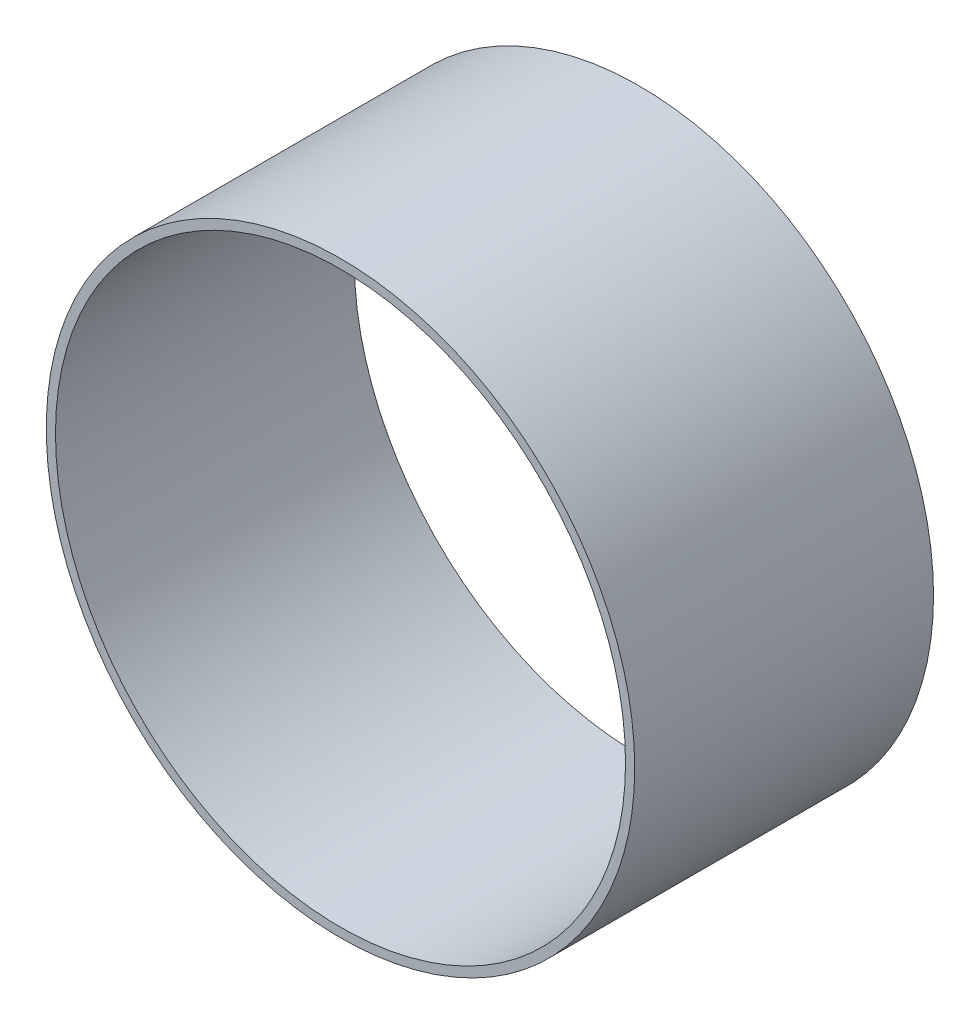
ISO-10303-21;
HEADER;
FILE_DESCRIPTION(('STEP AP214'),'2;1');
FILE_NAME('part.step','',(''),(''),'','','');
FILE_SCHEMA(('AUTOMOTIVE_DESIGN { 1 0 10303 214 1 1 1 1 }'));
ENDSEC;
DATA;
#1=APPLICATION_CONTEXT('core data for automotive mechanical design processes');
#2=APPLICATION_PROTOCOL_DEFINITION('international standard','automotive_design',2000,#1);
#3=PRODUCT_CONTEXT('',#1,'mechanical');
#4=PRODUCT('Part','Part','',(#3));
#5=PRODUCT_RELATED_PRODUCT_CATEGORY('part','',(#4));
#6=PRODUCT_DEFINITION_FORMATION('','',#4);
#7=PRODUCT_DEFINITION_CONTEXT('part definition',#1,'design');
#8=PRODUCT_DEFINITION('design','',#6,#7);
#9=PRODUCT_DEFINITION_SHAPE('','',#8);
#10=(LENGTH_UNIT() NAMED_UNIT(*) SI_UNIT(.MILLI.,.METRE.));
#11=(NAMED_UNIT(*) PLANE_ANGLE_UNIT() SI_UNIT($,.RADIAN.));
#12=(NAMED_UNIT(*) SI_UNIT($,.STERADIAN.) SOLID_ANGLE_UNIT());
#13=UNCERTAINTY_MEASURE_WITH_UNIT(LENGTH_MEASURE(1.E-05),#10,'distance_accuracy_value','');
#14=(GEOMETRIC_REPRESENTATION_CONTEXT(3) GLOBAL_UNCERTAINTY_ASSIGNED_CONTEXT((#13)) GLOBAL_UNIT_ASSIGNED_CONTEXT((#10,
#11,#12)) REPRESENTATION_CONTEXT('',''));
#15=CARTESIAN_POINT('',(0.,0.,0.));
#16=DIRECTION('',(0.,0.,1.));
#17=DIRECTION('',(1.,0.,0.));
#18=AXIS2_PLACEMENT_3D('',#15,#16,#17);
#19=CARTESIAN_POINT('',(0.,0.,33.));
#20=DIRECTION('',(0.,0.,1.));
#21=DIRECTION('',(1.,0.,0.));
#22=AXIS2_PLACEMENT_3D('',#19,#20,#21);
#23=PLANE('',#22);
#24=CARTESIAN_POINT('',(0.,0.,33.));
#25=DIRECTION('',(0.,0.,1.));
#26=DIRECTION('',(1.,0.,0.));
#27=AXIS2_PLACEMENT_3D('',#24,#25,#26);
#28=CIRCLE('',#27,64.);
#29=CARTESIAN_POINT('',(64.,0.,33.));
#30=VERTEX_POINT('',#29);
#31=EDGE_CURVE('E10',#30,#30,#28,.T.);
#32=ORIENTED_EDGE('',*,*,#31,.T.);
#33=EDGE_LOOP('',(#32));
#34=FACE_BOUND('',#33,.T.);
#35=CARTESIAN_POINT('',(0.,0.,33.));
#36=DIRECTION('',(0.,0.,1.));
#37=DIRECTION('',(1.,0.,0.));
#38=AXIS2_PLACEMENT_3D('',#35,#36,#37);
#39=CIRCLE('',#38,62.);
#40=CARTESIAN_POINT('',(62.,0.,33.));
#41=VERTEX_POINT('',#40);
#42=EDGE_CURVE('E49',#41,#41,#39,.T.);
#43=ORIENTED_EDGE('',*,*,#42,.F.);
#44=EDGE_LOOP('',(#43));
#45=FACE_BOUND('',#44,.T.);
#46=ADVANCED_FACE('F36',(#34,#45),#23,.T.);
#47=CARTESIAN_POINT('',(0.,0.,-32.));
#48=DIRECTION('',(0.,0.,1.));
#49=DIRECTION('',(1.,0.,0.));
#50=AXIS2_PLACEMENT_3D('',#47,#48,#49);
#51=PLANE('',#50);
#52=CARTESIAN_POINT('',(0.,0.,-32.));
#53=DIRECTION('',(0.,0.,1.));
#54=DIRECTION('',(1.,0.,0.));
#55=AXIS2_PLACEMENT_3D('',#52,#53,#54);
#56=CIRCLE('',#55,64.);
#57=CARTESIAN_POINT('',(64.,0.,-32.));
#58=VERTEX_POINT('',#57);
#59=EDGE_CURVE('E40',#58,#58,#56,.T.);
#60=ORIENTED_EDGE('',*,*,#59,.F.);
#61=EDGE_LOOP('',(#60));
#62=FACE_BOUND('',#61,.T.);
#63=CARTESIAN_POINT('',(0.,0.,-32.));
#64=DIRECTION('',(0.,0.,1.));
#65=DIRECTION('',(1.,0.,0.));
#66=AXIS2_PLACEMENT_3D('',#63,#64,#65);
#67=CIRCLE('',#66,62.);
#68=CARTESIAN_POINT('',(62.,0.,-32.));
#69=VERTEX_POINT('',#68);
#70=EDGE_CURVE('E51',#69,#69,#67,.T.);
#71=ORIENTED_EDGE('',*,*,#70,.T.);
#72=EDGE_LOOP('',(#71));
#73=FACE_BOUND('',#72,.T.);
#74=ADVANCED_FACE('F63',(#62,#73),#51,.F.);
#75=CARTESIAN_POINT('',(0.,0.,33.));
#76=DIRECTION('',(0.,0.,-1.));
#77=DIRECTION('',(-1.,0.,0.));
#78=AXIS2_PLACEMENT_3D('',#75,#76,#77);
#79=CYLINDRICAL_SURFACE('',#78,64.);
#80=ORIENTED_EDGE('',*,*,#31,.F.);
#81=EDGE_LOOP('',(#80));
#82=FACE_BOUND('',#81,.T.);
#83=ORIENTED_EDGE('',*,*,#59,.T.);
#84=EDGE_LOOP('',(#83));
#85=FACE_BOUND('',#84,.T.);
#86=ADVANCED_FACE('F38',(#82,#85),#79,.T.);
#87=CARTESIAN_POINT('',(0.,0.,33.));
#88=DIRECTION('',(0.,0.,-1.));
#89=DIRECTION('',(-1.,0.,0.));
#90=AXIS2_PLACEMENT_3D('',#87,#88,#89);
#91=CYLINDRICAL_SURFACE('',#90,62.);
#92=ORIENTED_EDGE('',*,*,#42,.T.);
#93=EDGE_LOOP('',(#92));
#94=FACE_BOUND('',#93,.T.);
#95=ORIENTED_EDGE('',*,*,#70,.F.);
#96=EDGE_LOOP('',(#95));
#97=FACE_BOUND('',#96,.T.);
#98=ADVANCED_FACE('F59',(#94,#97),#91,.F.);
#99=CLOSED_SHELL('',(#46,#74,#86,#98));
#100=MANIFOLD_SOLID_BREP('B2',#99);
#101=ADVANCED_BREP_SHAPE_REPRESENTATION('',(#18,#100),#14);
#102=SHAPE_DEFINITION_REPRESENTATION(#9,#101);
ENDSEC;
END-ISO-10303-21;
